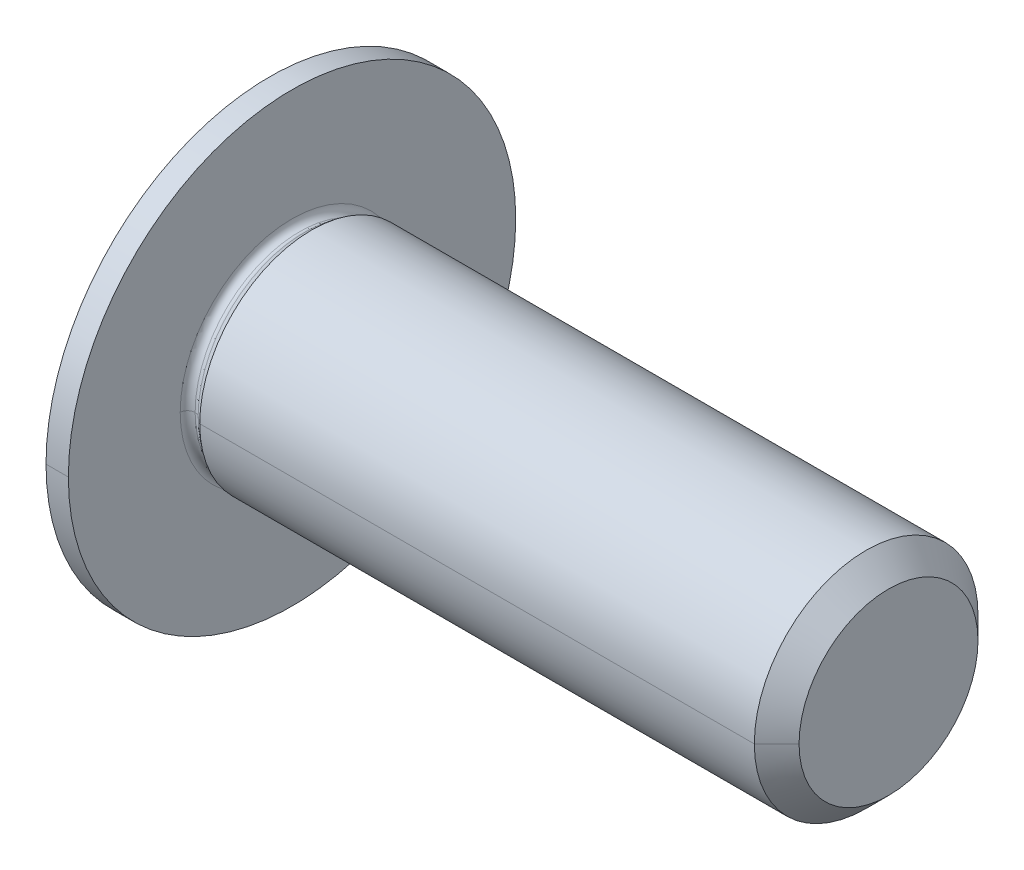
ISO-10303-21;
HEADER;
FILE_DESCRIPTION(('STEP AP214'),'2;1');
FILE_NAME('part.step','',(''),(''),'','','');
FILE_SCHEMA(('AUTOMOTIVE_DESIGN { 1 0 10303 214 1 1 1 1 }'));
ENDSEC;
DATA;
#1=APPLICATION_CONTEXT('core data for automotive mechanical design processes');
#2=APPLICATION_PROTOCOL_DEFINITION('international standard','automotive_design',2000,#1);
#3=PRODUCT_CONTEXT('',#1,'mechanical');
#4=PRODUCT('Part','Part','',(#3));
#5=PRODUCT_RELATED_PRODUCT_CATEGORY('part','',(#4));
#6=PRODUCT_DEFINITION_FORMATION('','',#4);
#7=PRODUCT_DEFINITION_CONTEXT('part definition',#1,'design');
#8=PRODUCT_DEFINITION('design','',#6,#7);
#9=PRODUCT_DEFINITION_SHAPE('','',#8);
#10=(LENGTH_UNIT() NAMED_UNIT(*) SI_UNIT(.MILLI.,.METRE.));
#11=(NAMED_UNIT(*) PLANE_ANGLE_UNIT() SI_UNIT($,.RADIAN.));
#12=(NAMED_UNIT(*) SI_UNIT($,.STERADIAN.) SOLID_ANGLE_UNIT());
#13=UNCERTAINTY_MEASURE_WITH_UNIT(LENGTH_MEASURE(1.E-05),#10,'distance_accuracy_value','');
#14=(GEOMETRIC_REPRESENTATION_CONTEXT(3) GLOBAL_UNCERTAINTY_ASSIGNED_CONTEXT((#13)) GLOBAL_UNIT_ASSIGNED_CONTEXT((#10,
#11,#12)) REPRESENTATION_CONTEXT('',''));
#15=CARTESIAN_POINT('',(0.,0.,0.));
#16=DIRECTION('',(0.,0.,1.));
#17=DIRECTION('',(1.,0.,0.));
#18=AXIS2_PLACEMENT_3D('',#15,#16,#17);
#19=CARTESIAN_POINT('',(-6.16182572614108,1.42301269667484,-0.821576763485476));
#20=DIRECTION('',(-0.966234939601246,0.22314240099168,-0.128831325280166));
#21=DIRECTION('',(-0.132163720091018,0.,0.991227900682635));
#22=AXIS2_PLACEMENT_3D('',#19,#20,#21);
#23=PLANE('',#22);
#24=DIRECTION('',(-0.225017580185204,-0.487177351846224,0.843815925694518));
#25=VECTOR('',#24,1.);
#26=CARTESIAN_POINT('',(-6.6,0.,0.));
#27=LINE('',#26,#25);
#28=CARTESIAN_POINT('',(-6.6,0.,0.));
#29=VERTEX_POINT('',#28);
#30=CARTESIAN_POINT('',(-6.8,-0.43301270189222,0.75));
#31=VERTEX_POINT('',#30);
#32=EDGE_CURVE('E176',#29,#31,#27,.T.);
#33=ORIENTED_EDGE('',*,*,#32,.F.);
#34=DIRECTION('',(-0.225017580185204,-0.974354703692446,0.));
#35=VECTOR('',#34,1.);
#36=CARTESIAN_POINT('',(-6.6,0.,0.));
#37=LINE('',#36,#35);
#38=CARTESIAN_POINT('',(-6.8,-0.866025403784439,0.));
#39=VERTEX_POINT('',#38);
#40=EDGE_CURVE('E10',#29,#39,#37,.T.);
#41=ORIENTED_EDGE('',*,*,#40,.T.);
#42=DIRECTION('',(0.,0.5,0.866025403784439));
#43=VECTOR('',#42,1.);
#44=CARTESIAN_POINT('',(-6.8,-0.433012701892218,0.75));
#45=LINE('',#44,#43);
#46=EDGE_CURVE('E231',#39,#31,#45,.T.);
#47=ORIENTED_EDGE('',*,*,#46,.T.);
#48=EDGE_LOOP('',(#33,#41,#47));
#49=FACE_BOUND('',#48,.T.);
#50=ADVANCED_FACE('F16',(#49),#23,.T.);
#51=CARTESIAN_POINT('',(-6.16182572614108,1.42301269667484,0.821576763485476));
#52=DIRECTION('',(-0.966234939601246,0.22314240099168,0.128831325280166));
#53=DIRECTION('',(0.132163720091018,0.,0.991227900682635));
#54=AXIS2_PLACEMENT_3D('',#51,#52,#53);
#55=PLANE('',#54);
#56=ORIENTED_EDGE('',*,*,#40,.F.);
#57=DIRECTION('',(-0.225017580185204,-0.487177351846223,-0.843815925694518));
#58=VECTOR('',#57,1.);
#59=CARTESIAN_POINT('',(-6.6,0.,0.));
#60=LINE('',#59,#58);
#61=CARTESIAN_POINT('',(-6.8,-0.43301270189222,-0.75));
#62=VERTEX_POINT('',#61);
#63=EDGE_CURVE('E27',#29,#62,#60,.T.);
#64=ORIENTED_EDGE('',*,*,#63,.T.);
#65=DIRECTION('',(0.,-0.5,0.866025403784438));
#66=VECTOR('',#65,1.);
#67=CARTESIAN_POINT('',(-6.8,-0.86602540378444,0.));
#68=LINE('',#67,#66);
#69=EDGE_CURVE('E20',#62,#39,#68,.T.);
#70=ORIENTED_EDGE('',*,*,#69,.T.);
#71=EDGE_LOOP('',(#56,#64,#70));
#72=FACE_BOUND('',#71,.T.);
#73=ADVANCED_FACE('F433',(#72),#55,.T.);
#74=CARTESIAN_POINT('',(-6.16182572614108,0.,1.64315352697095));
#75=DIRECTION('',(-0.966234939601246,0.,0.257662650560332));
#76=DIRECTION('',(0.,1.,0.));
#77=AXIS2_PLACEMENT_3D('',#74,#75,#76);
#78=PLANE('',#77);
#79=ORIENTED_EDGE('',*,*,#63,.F.);
#80=DIRECTION('',(-0.225017580185204,0.487177351846223,-0.843815925694518));
#81=VECTOR('',#80,1.);
#82=CARTESIAN_POINT('',(-6.6,0.,0.));
#83=LINE('',#82,#81);
#84=CARTESIAN_POINT('',(-6.8,0.43301270189222,-0.75));
#85=VERTEX_POINT('',#84);
#86=EDGE_CURVE('E277',#29,#85,#83,.T.);
#87=ORIENTED_EDGE('',*,*,#86,.T.);
#88=DIRECTION('',(0.,-1.,0.));
#89=VECTOR('',#88,1.);
#90=CARTESIAN_POINT('',(-6.8,0.,-0.75));
#91=LINE('',#90,#89);
#92=EDGE_CURVE('E241',#85,#62,#91,.T.);
#93=ORIENTED_EDGE('',*,*,#92,.T.);
#94=EDGE_LOOP('',(#79,#87,#93));
#95=FACE_BOUND('',#94,.T.);
#96=ADVANCED_FACE('F408',(#95),#78,.T.);
#97=CARTESIAN_POINT('',(-6.16182572614108,-1.42301269667484,0.821576763485475));
#98=DIRECTION('',(-0.966234939601246,-0.22314240099168,0.128831325280166));
#99=DIRECTION('',(-0.225017580185204,0.974354703692446,0.));
#100=AXIS2_PLACEMENT_3D('',#97,#98,#99);
#101=PLANE('',#100);
#102=ORIENTED_EDGE('',*,*,#86,.F.);
#103=DIRECTION('',(-0.225017580185204,0.974354703692446,0.));
#104=VECTOR('',#103,1.);
#105=CARTESIAN_POINT('',(-6.6,0.,0.));
#106=LINE('',#105,#104);
#107=CARTESIAN_POINT('',(-6.8,0.866025403784439,0.));
#108=VERTEX_POINT('',#107);
#109=EDGE_CURVE('E173',#29,#108,#106,.T.);
#110=ORIENTED_EDGE('',*,*,#109,.T.);
#111=DIRECTION('',(0.,-0.5,-0.866025403784439));
#112=VECTOR('',#111,1.);
#113=CARTESIAN_POINT('',(-6.8,0.43301270189222,-0.75));
#114=LINE('',#113,#112);
#115=EDGE_CURVE('E240',#108,#85,#114,.T.);
#116=ORIENTED_EDGE('',*,*,#115,.T.);
#117=EDGE_LOOP('',(#102,#110,#116));
#118=FACE_BOUND('',#117,.T.);
#119=ADVANCED_FACE('F18',(#118),#101,.T.);
#120=CARTESIAN_POINT('',(-6.16182572614108,0.,-1.64315352697095));
#121=DIRECTION('',(-0.966234939601246,0.,-0.257662650560332));
#122=DIRECTION('',(-0.257662650560332,0.,0.966234939601246));
#123=AXIS2_PLACEMENT_3D('',#120,#121,#122);
#124=PLANE('',#123);
#125=DIRECTION('',(-0.225017580185204,0.487177351846224,0.843815925694518));
#126=VECTOR('',#125,1.);
#127=CARTESIAN_POINT('',(-6.6,0.,0.));
#128=LINE('',#127,#126);
#129=CARTESIAN_POINT('',(-6.8,0.43301270189222,0.75));
#130=VERTEX_POINT('',#129);
#131=EDGE_CURVE('E167',#29,#130,#128,.T.);
#132=ORIENTED_EDGE('',*,*,#131,.F.);
#133=ORIENTED_EDGE('',*,*,#32,.T.);
#134=DIRECTION('',(0.,1.,0.));
#135=VECTOR('',#134,1.);
#136=CARTESIAN_POINT('',(-6.8,0.,0.75));
#137=LINE('',#136,#135);
#138=EDGE_CURVE('E179',#31,#130,#137,.T.);
#139=ORIENTED_EDGE('',*,*,#138,.T.);
#140=EDGE_LOOP('',(#132,#133,#139));
#141=FACE_BOUND('',#140,.T.);
#142=ADVANCED_FACE('F181',(#141),#124,.T.);
#143=CARTESIAN_POINT('',(-6.16182572614108,-1.42301269667484,-0.821576763485475));
#144=DIRECTION('',(-0.966234939601246,-0.22314240099168,-0.128831325280166));
#145=DIRECTION('',(-0.225017580185204,0.974354703692446,0.));
#146=AXIS2_PLACEMENT_3D('',#143,#144,#145);
#147=PLANE('',#146);
#148=ORIENTED_EDGE('',*,*,#109,.F.);
#149=ORIENTED_EDGE('',*,*,#131,.T.);
#150=DIRECTION('',(0.,0.5,-0.866025403784439));
#151=VECTOR('',#150,1.);
#152=CARTESIAN_POINT('',(-6.8,0.866025403784439,0.));
#153=LINE('',#152,#151);
#154=EDGE_CURVE('E171',#130,#108,#153,.T.);
#155=ORIENTED_EDGE('',*,*,#154,.T.);
#156=EDGE_LOOP('',(#148,#149,#155));
#157=FACE_BOUND('',#156,.T.);
#158=ADVANCED_FACE('F169',(#157),#147,.T.);
#159=CARTESIAN_POINT('',(0.,0.,0.));
#160=DIRECTION('',(-1.,0.,0.));
#161=DIRECTION('',(0.,0.,1.));
#162=AXIS2_PLACEMENT_3D('',#159,#160,#161);
#163=CONICAL_SURFACE('',#162,1.2,0.785398163397448);
#164=DIRECTION('',(-0.707106781186548,0.,-0.707106781186547));
#165=VECTOR('',#164,1.);
#166=CARTESIAN_POINT('',(0.,0.,-1.2));
#167=LINE('',#166,#165);
#168=CARTESIAN_POINT('',(0.,0.,-1.2));
#169=VERTEX_POINT('',#168);
#170=CARTESIAN_POINT('',(-0.3,0.,-1.5));
#171=VERTEX_POINT('',#170);
#172=EDGE_CURVE('E216',#169,#171,#167,.T.);
#173=ORIENTED_EDGE('',*,*,#172,.F.);
#174=CARTESIAN_POINT('',(0.,0.,0.));
#175=DIRECTION('',(1.,0.,0.));
#176=DIRECTION('',(0.,0.,-1.));
#177=AXIS2_PLACEMENT_3D('',#174,#175,#176);
#178=CIRCLE('',#177,1.2);
#179=CARTESIAN_POINT('',(0.,0.,1.2));
#180=VERTEX_POINT('',#179);
#181=EDGE_CURVE('E111',#180,#169,#178,.T.);
#182=ORIENTED_EDGE('',*,*,#181,.F.);
#183=DIRECTION('',(-0.707106781186548,0.,0.707106781186547));
#184=VECTOR('',#183,1.);
#185=CARTESIAN_POINT('',(0.,0.,1.2));
#186=LINE('',#185,#184);
#187=CARTESIAN_POINT('',(-0.3,0.,1.5));
#188=VERTEX_POINT('',#187);
#189=EDGE_CURVE('E268',#180,#188,#186,.T.);
#190=ORIENTED_EDGE('',*,*,#189,.T.);
#191=CARTESIAN_POINT('',(-0.3,0.,0.));
#192=DIRECTION('',(-1.,0.,0.));
#193=DIRECTION('',(0.,0.,-1.));
#194=AXIS2_PLACEMENT_3D('',#191,#192,#193);
#195=CIRCLE('',#194,1.5);
#196=EDGE_CURVE('E102',#171,#188,#195,.T.);
#197=ORIENTED_EDGE('',*,*,#196,.F.);
#198=EDGE_LOOP('',(#173,#182,#190,#197));
#199=FACE_BOUND('',#198,.T.);
#200=ADVANCED_FACE('F579',(#199),#163,.T.);
#201=CARTESIAN_POINT('',(-6.8,0.866025403784439,0.));
#202=DIRECTION('',(0.,0.866025403784439,-0.5));
#203=DIRECTION('',(-1.,0.,0.));
#204=AXIS2_PLACEMENT_3D('',#201,#202,#203);
#205=PLANE('',#204);
#206=DIRECTION('',(0.,-0.5,-0.866025403784439));
#207=VECTOR('',#206,1.);
#208=CARTESIAN_POINT('',(-8.8,0.866025403784439,0.));
#209=LINE('',#208,#207);
#210=CARTESIAN_POINT('',(-8.8,0.866025403784439,0.));
#211=VERTEX_POINT('',#210);
#212=CARTESIAN_POINT('',(-8.8,0.43301270189222,-0.75));
#213=VERTEX_POINT('',#212);
#214=EDGE_CURVE('E206',#211,#213,#209,.T.);
#215=ORIENTED_EDGE('',*,*,#214,.T.);
#216=DIRECTION('',(-1.,0.,0.));
#217=VECTOR('',#216,1.);
#218=CARTESIAN_POINT('',(-6.8,0.43301270189222,-0.75));
#219=LINE('',#218,#217);
#220=EDGE_CURVE('E237',#85,#213,#219,.T.);
#221=ORIENTED_EDGE('',*,*,#220,.F.);
#222=ORIENTED_EDGE('',*,*,#115,.F.);
#223=DIRECTION('',(-1.,0.,0.));
#224=VECTOR('',#223,1.);
#225=CARTESIAN_POINT('',(-6.8,0.866025403784439,0.));
#226=LINE('',#225,#224);
#227=EDGE_CURVE('E199',#108,#211,#226,.T.);
#228=ORIENTED_EDGE('',*,*,#227,.T.);
#229=EDGE_LOOP('',(#215,#221,#222,#228));
#230=FACE_BOUND('',#229,.T.);
#231=ADVANCED_FACE('F464',(#230),#205,.F.);
#232=CARTESIAN_POINT('',(-6.8,0.43301270189222,-0.75));
#233=DIRECTION('',(0.,0.,-1.));
#234=DIRECTION('',(0.,-1.,0.));
#235=AXIS2_PLACEMENT_3D('',#232,#233,#234);
#236=PLANE('',#235);
#237=DIRECTION('',(0.,-1.,0.));
#238=VECTOR('',#237,1.);
#239=CARTESIAN_POINT('',(-8.8,0.43301270189222,-0.75));
#240=LINE('',#239,#238);
#241=CARTESIAN_POINT('',(-8.8,-0.433012701892219,-0.75));
#242=VERTEX_POINT('',#241);
#243=EDGE_CURVE('E246',#213,#242,#240,.T.);
#244=ORIENTED_EDGE('',*,*,#243,.T.);
#245=DIRECTION('',(-1.,0.,0.));
#246=VECTOR('',#245,1.);
#247=CARTESIAN_POINT('',(-6.8,-0.433012701892219,-0.75));
#248=LINE('',#247,#246);
#249=EDGE_CURVE('E334',#62,#242,#248,.T.);
#250=ORIENTED_EDGE('',*,*,#249,.F.);
#251=ORIENTED_EDGE('',*,*,#92,.F.);
#252=ORIENTED_EDGE('',*,*,#220,.T.);
#253=EDGE_LOOP('',(#244,#250,#251,#252));
#254=FACE_BOUND('',#253,.T.);
#255=ADVANCED_FACE('F458',(#254),#236,.F.);
#256=CARTESIAN_POINT('',(-6.8,-0.433012701892219,-0.75));
#257=DIRECTION('',(0.,-0.866025403784439,-0.5));
#258=DIRECTION('',(0.,0.5,-0.866025403784439));
#259=AXIS2_PLACEMENT_3D('',#256,#257,#258);
#260=PLANE('',#259);
#261=DIRECTION('',(0.,-0.5,0.866025403784439));
#262=VECTOR('',#261,1.);
#263=CARTESIAN_POINT('',(-8.8,-0.433012701892219,-0.75));
#264=LINE('',#263,#262);
#265=CARTESIAN_POINT('',(-8.8,-0.866025403784439,0.));
#266=VERTEX_POINT('',#265);
#267=EDGE_CURVE('E242',#242,#266,#264,.T.);
#268=ORIENTED_EDGE('',*,*,#267,.T.);
#269=DIRECTION('',(-1.,0.,0.));
#270=VECTOR('',#269,1.);
#271=CARTESIAN_POINT('',(-6.8,-0.866025403784439,0.));
#272=LINE('',#271,#270);
#273=EDGE_CURVE('E228',#39,#266,#272,.T.);
#274=ORIENTED_EDGE('',*,*,#273,.F.);
#275=ORIENTED_EDGE('',*,*,#69,.F.);
#276=ORIENTED_EDGE('',*,*,#249,.T.);
#277=EDGE_LOOP('',(#268,#274,#275,#276));
#278=FACE_BOUND('',#277,.T.);
#279=ADVANCED_FACE('F463',(#278),#260,.F.);
#280=CARTESIAN_POINT('',(-6.8,-0.866025403784439,0.));
#281=DIRECTION('',(0.,-0.866025403784439,0.5));
#282=DIRECTION('',(-1.,0.,0.));
#283=AXIS2_PLACEMENT_3D('',#280,#281,#282);
#284=PLANE('',#283);
#285=DIRECTION('',(0.,0.5,0.866025403784439));
#286=VECTOR('',#285,1.);
#287=CARTESIAN_POINT('',(-8.8,-0.866025403784439,0.));
#288=LINE('',#287,#286);
#289=CARTESIAN_POINT('',(-8.8,-0.43301270189222,0.75));
#290=VERTEX_POINT('',#289);
#291=EDGE_CURVE('E247',#266,#290,#288,.T.);
#292=ORIENTED_EDGE('',*,*,#291,.T.);
#293=DIRECTION('',(-1.,0.,0.));
#294=VECTOR('',#293,1.);
#295=CARTESIAN_POINT('',(-6.8,-0.43301270189222,0.75));
#296=LINE('',#295,#294);
#297=EDGE_CURVE('E186',#31,#290,#296,.T.);
#298=ORIENTED_EDGE('',*,*,#297,.F.);
#299=ORIENTED_EDGE('',*,*,#46,.F.);
#300=ORIENTED_EDGE('',*,*,#273,.T.);
#301=EDGE_LOOP('',(#292,#298,#299,#300));
#302=FACE_BOUND('',#301,.T.);
#303=ADVANCED_FACE('F449',(#302),#284,.F.);
#304=CARTESIAN_POINT('',(-6.8,-0.43301270189222,0.75));
#305=DIRECTION('',(0.,0.,1.));
#306=DIRECTION('',(0.,-1.,0.));
#307=AXIS2_PLACEMENT_3D('',#304,#305,#306);
#308=PLANE('',#307);
#309=DIRECTION('',(0.,1.,0.));
#310=VECTOR('',#309,1.);
#311=CARTESIAN_POINT('',(-8.8,-0.43301270189222,0.75));
#312=LINE('',#311,#310);
#313=CARTESIAN_POINT('',(-8.8,0.43301270189222,0.75));
#314=VERTEX_POINT('',#313);
#315=EDGE_CURVE('E192',#290,#314,#312,.T.);
#316=ORIENTED_EDGE('',*,*,#315,.T.);
#317=DIRECTION('',(-1.,0.,0.));
#318=VECTOR('',#317,1.);
#319=CARTESIAN_POINT('',(-6.8,0.43301270189222,0.75));
#320=LINE('',#319,#318);
#321=EDGE_CURVE('E187',#130,#314,#320,.T.);
#322=ORIENTED_EDGE('',*,*,#321,.F.);
#323=ORIENTED_EDGE('',*,*,#138,.F.);
#324=ORIENTED_EDGE('',*,*,#297,.T.);
#325=EDGE_LOOP('',(#316,#322,#323,#324));
#326=FACE_BOUND('',#325,.T.);
#327=ADVANCED_FACE('F190',(#326),#308,.F.);
#328=CARTESIAN_POINT('',(-6.8,0.43301270189222,0.75));
#329=DIRECTION('',(0.,0.866025403784439,0.5));
#330=DIRECTION('',(1.,0.,0.));
#331=AXIS2_PLACEMENT_3D('',#328,#329,#330);
#332=PLANE('',#331);
#333=DIRECTION('',(0.,0.5,-0.866025403784439));
#334=VECTOR('',#333,1.);
#335=CARTESIAN_POINT('',(-8.8,0.43301270189222,0.75));
#336=LINE('',#335,#334);
#337=EDGE_CURVE('E218',#314,#211,#336,.T.);
#338=ORIENTED_EDGE('',*,*,#337,.T.);
#339=ORIENTED_EDGE('',*,*,#227,.F.);
#340=ORIENTED_EDGE('',*,*,#154,.F.);
#341=ORIENTED_EDGE('',*,*,#321,.T.);
#342=EDGE_LOOP('',(#338,#339,#340,#341));
#343=FACE_BOUND('',#342,.T.);
#344=ADVANCED_FACE('F198',(#343),#332,.F.);
#345=CARTESIAN_POINT('',(-8.8,1.6262612902727,0.));
#346=DIRECTION('',(-1.,0.,0.));
#347=DIRECTION('',(0.,0.,1.));
#348=AXIS2_PLACEMENT_3D('',#345,#346,#347);
#349=PLANE('',#348);
#350=ORIENTED_EDGE('',*,*,#337,.F.);
#351=ORIENTED_EDGE('',*,*,#315,.F.);
#352=ORIENTED_EDGE('',*,*,#291,.F.);
#353=ORIENTED_EDGE('',*,*,#267,.F.);
#354=ORIENTED_EDGE('',*,*,#243,.F.);
#355=ORIENTED_EDGE('',*,*,#214,.F.);
#356=EDGE_LOOP('',(#350,#351,#352,#353,#354,#355));
#357=FACE_BOUND('',#356,.T.);
#358=CARTESIAN_POINT('',(-8.8,0.,0.));
#359=DIRECTION('',(1.,0.,0.));
#360=DIRECTION('',(0.,0.,-1.));
#361=AXIS2_PLACEMENT_3D('',#358,#359,#360);
#362=CIRCLE('',#361,1.6262612902727);
#363=CARTESIAN_POINT('',(-8.8,0.,-1.6262612902727));
#364=VERTEX_POINT('',#363);
#365=CARTESIAN_POINT('',(-8.8,0.,1.6262612902727));
#366=VERTEX_POINT('',#365);
#367=EDGE_CURVE('E259',#364,#366,#362,.T.);
#368=ORIENTED_EDGE('',*,*,#367,.F.);
#369=CARTESIAN_POINT('',(-8.8,0.,0.));
#370=DIRECTION('',(1.,0.,0.));
#371=DIRECTION('',(0.,0.,-1.));
#372=AXIS2_PLACEMENT_3D('',#369,#370,#371);
#373=CIRCLE('',#372,1.6262612902727);
#374=EDGE_CURVE('E221',#366,#364,#373,.T.);
#375=ORIENTED_EDGE('',*,*,#374,.F.);
#376=EDGE_LOOP('',(#368,#375));
#377=FACE_BOUND('',#376,.T.);
#378=ADVANCED_FACE('F559',(#357,#377),#349,.T.);
#379=CARTESIAN_POINT('',(-8.3,0.,0.));
#380=DIRECTION('',(1.,0.,0.));
#381=DIRECTION('',(0.,0.,-1.));
#382=AXIS2_PLACEMENT_3D('',#379,#380,#381);
#383=CONICAL_SURFACE('',#382,3.,1.22173047639603);
#384=DIRECTION('',(0.34202014332567,0.,0.939692620785908));
#385=VECTOR('',#384,1.);
#386=CARTESIAN_POINT('',(-8.3,0.,3.));
#387=LINE('',#386,#385);
#388=CARTESIAN_POINT('',(-8.3,0.,3.));
#389=VERTEX_POINT('',#388);
#390=EDGE_CURVE('E254',#366,#389,#387,.T.);
#391=ORIENTED_EDGE('',*,*,#390,.F.);
#392=ORIENTED_EDGE('',*,*,#374,.T.);
#393=DIRECTION('',(0.34202014332567,0.,-0.939692620785908));
#394=VECTOR('',#393,1.);
#395=CARTESIAN_POINT('',(-8.3,0.,-3.));
#396=LINE('',#395,#394);
#397=CARTESIAN_POINT('',(-8.3,0.,-3.));
#398=VERTEX_POINT('',#397);
#399=EDGE_CURVE('E314',#364,#398,#396,.T.);
#400=ORIENTED_EDGE('',*,*,#399,.T.);
#401=CARTESIAN_POINT('',(-8.3,0.,0.));
#402=DIRECTION('',(1.,0.,0.));
#403=DIRECTION('',(0.,0.,-1.));
#404=AXIS2_PLACEMENT_3D('',#401,#402,#403);
#405=CIRCLE('',#404,3.);
#406=EDGE_CURVE('E290',#389,#398,#405,.T.);
#407=ORIENTED_EDGE('',*,*,#406,.F.);
#408=EDGE_LOOP('',(#391,#392,#400,#407));
#409=FACE_BOUND('',#408,.T.);
#410=ADVANCED_FACE('F517',(#409),#383,.T.);
#411=CARTESIAN_POINT('',(0.,0.,0.));
#412=DIRECTION('',(1.,0.,0.));
#413=DIRECTION('',(0.,0.,-1.));
#414=AXIS2_PLACEMENT_3D('',#411,#412,#413);
#415=CYLINDRICAL_SURFACE('',#414,3.);
#416=DIRECTION('',(1.,0.,0.));
#417=VECTOR('',#416,1.);
#418=CARTESIAN_POINT('',(0.,0.,3.));
#419=LINE('',#418,#417);
#420=CARTESIAN_POINT('',(-8.,0.,3.));
#421=VERTEX_POINT('',#420);
#422=EDGE_CURVE('E273',#389,#421,#419,.T.);
#423=ORIENTED_EDGE('',*,*,#422,.F.);
#424=ORIENTED_EDGE('',*,*,#406,.T.);
#425=DIRECTION('',(1.,0.,0.));
#426=VECTOR('',#425,1.);
#427=CARTESIAN_POINT('',(0.,0.,-3.));
#428=LINE('',#427,#426);
#429=CARTESIAN_POINT('',(-8.,0.,-3.));
#430=VERTEX_POINT('',#429);
#431=EDGE_CURVE('E272',#398,#430,#428,.T.);
#432=ORIENTED_EDGE('',*,*,#431,.T.);
#433=CARTESIAN_POINT('',(-8.,0.,0.));
#434=DIRECTION('',(1.,0.,0.));
#435=DIRECTION('',(0.,0.,-1.));
#436=AXIS2_PLACEMENT_3D('',#433,#434,#435);
#437=CIRCLE('',#436,3.);
#438=EDGE_CURVE('E288',#421,#430,#437,.T.);
#439=ORIENTED_EDGE('',*,*,#438,.F.);
#440=EDGE_LOOP('',(#423,#424,#432,#439));
#441=FACE_BOUND('',#440,.T.);
#442=ADVANCED_FACE('F511',(#441),#415,.T.);
#443=CARTESIAN_POINT('',(-8.,1.5,0.));
#444=DIRECTION('',(1.,0.,0.));
#445=DIRECTION('',(0.,1.,0.));
#446=AXIS2_PLACEMENT_3D('',#443,#444,#445);
#447=PLANE('',#446);
#448=CARTESIAN_POINT('',(-8.,0.,0.));
#449=DIRECTION('',(1.,0.,0.));
#450=DIRECTION('',(0.,0.,-1.));
#451=AXIS2_PLACEMENT_3D('',#448,#449,#450);
#452=CIRCLE('',#451,1.5);
#453=CARTESIAN_POINT('',(-8.,0.,-1.5));
#454=VERTEX_POINT('',#453);
#455=CARTESIAN_POINT('',(-8.,0.,1.5));
#456=VERTEX_POINT('',#455);
#457=EDGE_CURVE('E210',#454,#456,#452,.T.);
#458=ORIENTED_EDGE('',*,*,#457,.F.);
#459=CARTESIAN_POINT('',(-8.,0.,0.));
#460=DIRECTION('',(1.,0.,0.));
#461=DIRECTION('',(0.,0.,-1.));
#462=AXIS2_PLACEMENT_3D('',#459,#460,#461);
#463=CIRCLE('',#462,1.5);
#464=EDGE_CURVE('E360',#456,#454,#463,.T.);
#465=ORIENTED_EDGE('',*,*,#464,.F.);
#466=EDGE_LOOP('',(#458,#465));
#467=FACE_BOUND('',#466,.T.);
#468=CARTESIAN_POINT('',(-8.,0.,0.));
#469=DIRECTION('',(1.,0.,0.));
#470=DIRECTION('',(0.,0.,-1.));
#471=AXIS2_PLACEMENT_3D('',#468,#469,#470);
#472=CIRCLE('',#471,3.);
#473=EDGE_CURVE('E269',#430,#421,#472,.T.);
#474=ORIENTED_EDGE('',*,*,#473,.T.);
#475=ORIENTED_EDGE('',*,*,#438,.T.);
#476=EDGE_LOOP('',(#474,#475));
#477=FACE_BOUND('',#476,.T.);
#478=ADVANCED_FACE('F516',(#467,#477),#447,.T.);
#479=CARTESIAN_POINT('',(-7.9,0.,0.));
#480=DIRECTION('',(1.,0.,0.));
#481=DIRECTION('',(0.,0.,-1.));
#482=AXIS2_PLACEMENT_3D('',#479,#480,#481);
#483=TOROIDAL_SURFACE('',#482,1.5,0.1);
#484=CARTESIAN_POINT('',(-7.9,0.,0.));
#485=DIRECTION('',(1.,0.,0.));
#486=DIRECTION('',(0.,0.,-1.));
#487=AXIS2_PLACEMENT_3D('',#484,#485,#486);
#488=CIRCLE('',#487,1.4);
#489=CARTESIAN_POINT('',(-7.9,0.,-1.4));
#490=VERTEX_POINT('',#489);
#491=CARTESIAN_POINT('',(-7.9,0.,1.4));
#492=VERTEX_POINT('',#491);
#493=EDGE_CURVE('E264',#490,#492,#488,.T.);
#494=ORIENTED_EDGE('',*,*,#493,.F.);
#495=CARTESIAN_POINT('',(-7.9,0.,-1.5));
#496=DIRECTION('',(0.,-1.,0.));
#497=DIRECTION('',(0.,0.,-1.));
#498=AXIS2_PLACEMENT_3D('',#495,#496,#497);
#499=CIRCLE('',#498,0.1);
#500=EDGE_CURVE('E356',#490,#454,#499,.T.);
#501=ORIENTED_EDGE('',*,*,#500,.T.);
#502=ORIENTED_EDGE('',*,*,#457,.T.);
#503=CARTESIAN_POINT('',(-7.9,0.,1.5));
#504=DIRECTION('',(0.,1.,0.));
#505=DIRECTION('',(0.,0.,1.));
#506=AXIS2_PLACEMENT_3D('',#503,#504,#505);
#507=CIRCLE('',#506,0.1);
#508=EDGE_CURVE('E320',#492,#456,#507,.T.);
#509=ORIENTED_EDGE('',*,*,#508,.F.);
#510=EDGE_LOOP('',(#494,#501,#502,#509));
#511=FACE_BOUND('',#510,.T.);
#512=ADVANCED_FACE('F391',(#511),#483,.F.);
#513=CARTESIAN_POINT('',(-7.73819660112501,0.,0.));
#514=DIRECTION('',(1.,0.,0.));
#515=DIRECTION('',(0.,0.,-1.));
#516=AXIS2_PLACEMENT_3D('',#513,#514,#515);
#517=CONICAL_SURFACE('',#516,1.5,0.666239432492518);
#518=DIRECTION('',(0.786151377757421,0.,0.618033988749898));
#519=VECTOR('',#518,1.);
#520=CARTESIAN_POINT('',(-7.73819660112501,0.,1.5));
#521=LINE('',#520,#519);
#522=CARTESIAN_POINT('',(-7.83819660112501,0.,1.42138486222426));
#523=VERTEX_POINT('',#522);
#524=CARTESIAN_POINT('',(-7.73819660112501,0.,1.5));
#525=VERTEX_POINT('',#524);
#526=EDGE_CURVE('E227',#523,#525,#521,.T.);
#527=ORIENTED_EDGE('',*,*,#526,.F.);
#528=CARTESIAN_POINT('',(-7.83819660112501,0.,0.));
#529=DIRECTION('',(1.,0.,0.));
#530=DIRECTION('',(0.,0.,-1.));
#531=AXIS2_PLACEMENT_3D('',#528,#529,#530);
#532=CIRCLE('',#531,1.42138486222426);
#533=CARTESIAN_POINT('',(-7.83819660112501,0.,-1.42138486222426));
#534=VERTEX_POINT('',#533);
#535=EDGE_CURVE('E217',#523,#534,#532,.T.);
#536=ORIENTED_EDGE('',*,*,#535,.T.);
#537=DIRECTION('',(0.786151377757421,0.,-0.618033988749898));
#538=VECTOR('',#537,1.);
#539=CARTESIAN_POINT('',(-7.73819660112501,0.,-1.5));
#540=LINE('',#539,#538);
#541=CARTESIAN_POINT('',(-7.73819660112501,0.,-1.5));
#542=VERTEX_POINT('',#541);
#543=EDGE_CURVE('E226',#534,#542,#540,.T.);
#544=ORIENTED_EDGE('',*,*,#543,.T.);
#545=CARTESIAN_POINT('',(-7.73819660112501,0.,0.));
#546=DIRECTION('',(1.,0.,0.));
#547=DIRECTION('',(0.,0.,-1.));
#548=AXIS2_PLACEMENT_3D('',#545,#546,#547);
#549=CIRCLE('',#548,1.5);
#550=EDGE_CURVE('E234',#525,#542,#549,.T.);
#551=ORIENTED_EDGE('',*,*,#550,.F.);
#552=EDGE_LOOP('',(#527,#536,#544,#551));
#553=FACE_BOUND('',#552,.T.);
#554=ADVANCED_FACE('F595',(#553),#517,.T.);
#555=CARTESIAN_POINT('',(0.,0.,0.));
#556=DIRECTION('',(1.,0.,0.));
#557=DIRECTION('',(0.,0.,-1.));
#558=AXIS2_PLACEMENT_3D('',#555,#556,#557);
#559=CYLINDRICAL_SURFACE('',#558,1.5);
#560=DIRECTION('',(1.,0.,0.));
#561=VECTOR('',#560,1.);
#562=CARTESIAN_POINT('',(0.,0.,1.5));
#563=LINE('',#562,#561);
#564=EDGE_CURVE('E251',#525,#188,#563,.T.);
#565=ORIENTED_EDGE('',*,*,#564,.F.);
#566=ORIENTED_EDGE('',*,*,#550,.T.);
#567=DIRECTION('',(1.,0.,0.));
#568=VECTOR('',#567,1.);
#569=CARTESIAN_POINT('',(0.,0.,-1.5));
#570=LINE('',#569,#568);
#571=EDGE_CURVE('E248',#542,#171,#570,.T.);
#572=ORIENTED_EDGE('',*,*,#571,.T.);
#573=ORIENTED_EDGE('',*,*,#196,.T.);
#574=EDGE_LOOP('',(#565,#566,#572,#573));
#575=FACE_BOUND('',#574,.T.);
#576=ADVANCED_FACE('F626',(#575),#559,.T.);
#577=CARTESIAN_POINT('',(0.,0.,0.));
#578=DIRECTION('',(1.,0.,0.));
#579=DIRECTION('',(0.,1.,0.));
#580=AXIS2_PLACEMENT_3D('',#577,#578,#579);
#581=PLANE('',#580);
#582=ORIENTED_EDGE('',*,*,#181,.T.);
#583=CARTESIAN_POINT('',(0.,0.,0.));
#584=DIRECTION('',(1.,0.,0.));
#585=DIRECTION('',(0.,0.,-1.));
#586=AXIS2_PLACEMENT_3D('',#583,#584,#585);
#587=CIRCLE('',#586,1.2);
#588=EDGE_CURVE('E212',#169,#180,#587,.T.);
#589=ORIENTED_EDGE('',*,*,#588,.T.);
#590=EDGE_LOOP('',(#582,#589));
#591=FACE_BOUND('',#590,.T.);
#592=ADVANCED_FACE('F635',(#591),#581,.T.);
#593=CARTESIAN_POINT('',(0.,0.,0.));
#594=DIRECTION('',(1.,0.,0.));
#595=DIRECTION('',(0.,0.,-1.));
#596=AXIS2_PLACEMENT_3D('',#593,#594,#595);
#597=CYLINDRICAL_SURFACE('',#596,1.5);
#598=CARTESIAN_POINT('',(-7.73819660112501,0.,0.));
#599=DIRECTION('',(1.,0.,0.));
#600=DIRECTION('',(0.,0.,-1.));
#601=AXIS2_PLACEMENT_3D('',#598,#599,#600);
#602=CIRCLE('',#601,1.5);
#603=EDGE_CURVE('E222',#542,#525,#602,.T.);
#604=ORIENTED_EDGE('',*,*,#603,.T.);
#605=ORIENTED_EDGE('',*,*,#564,.T.);
#606=CARTESIAN_POINT('',(-0.3,0.,0.));
#607=DIRECTION('',(-1.,0.,0.));
#608=DIRECTION('',(0.,0.,-1.));
#609=AXIS2_PLACEMENT_3D('',#606,#607,#608);
#610=CIRCLE('',#609,1.5);
#611=EDGE_CURVE('E287',#188,#171,#610,.T.);
#612=ORIENTED_EDGE('',*,*,#611,.T.);
#613=ORIENTED_EDGE('',*,*,#571,.F.);
#614=EDGE_LOOP('',(#604,#605,#612,#613));
#615=FACE_BOUND('',#614,.T.);
#616=ADVANCED_FACE('F502',(#615),#597,.T.);
#617=CARTESIAN_POINT('',(-7.73819660112501,0.,0.));
#618=DIRECTION('',(1.,0.,0.));
#619=DIRECTION('',(0.,0.,-1.));
#620=AXIS2_PLACEMENT_3D('',#617,#618,#619);
#621=CONICAL_SURFACE('',#620,1.5,0.666239432492518);
#622=CARTESIAN_POINT('',(-7.83819660112501,0.,0.));
#623=DIRECTION('',(1.,0.,0.));
#624=DIRECTION('',(0.,0.,-1.));
#625=AXIS2_PLACEMENT_3D('',#622,#623,#624);
#626=CIRCLE('',#625,1.42138486222426);
#627=EDGE_CURVE('E278',#534,#523,#626,.T.);
#628=ORIENTED_EDGE('',*,*,#627,.T.);
#629=ORIENTED_EDGE('',*,*,#526,.T.);
#630=ORIENTED_EDGE('',*,*,#603,.F.);
#631=ORIENTED_EDGE('',*,*,#543,.F.);
#632=EDGE_LOOP('',(#628,#629,#630,#631));
#633=FACE_BOUND('',#632,.T.);
#634=ADVANCED_FACE('F497',(#633),#621,.T.);
#635=CARTESIAN_POINT('',(-7.9,0.,0.));
#636=DIRECTION('',(1.,0.,0.));
#637=DIRECTION('',(0.,0.,-1.));
#638=AXIS2_PLACEMENT_3D('',#635,#636,#637);
#639=TOROIDAL_SURFACE('',#638,1.5,0.1);
#640=CARTESIAN_POINT('',(-7.9,0.,0.));
#641=DIRECTION('',(1.,0.,0.));
#642=DIRECTION('',(0.,0.,-1.));
#643=AXIS2_PLACEMENT_3D('',#640,#641,#642);
#644=CIRCLE('',#643,1.4);
#645=EDGE_CURVE('E282',#492,#490,#644,.T.);
#646=ORIENTED_EDGE('',*,*,#645,.F.);
#647=ORIENTED_EDGE('',*,*,#508,.T.);
#648=ORIENTED_EDGE('',*,*,#464,.T.);
#649=ORIENTED_EDGE('',*,*,#500,.F.);
#650=EDGE_LOOP('',(#646,#647,#648,#649));
#651=FACE_BOUND('',#650,.T.);
#652=ADVANCED_FACE('F386',(#651),#639,.F.);
#653=CARTESIAN_POINT('',(0.,0.,0.));
#654=DIRECTION('',(1.,0.,0.));
#655=DIRECTION('',(0.,0.,-1.));
#656=AXIS2_PLACEMENT_3D('',#653,#654,#655);
#657=CYLINDRICAL_SURFACE('',#656,3.);
#658=CARTESIAN_POINT('',(-8.3,0.,0.));
#659=DIRECTION('',(1.,0.,0.));
#660=DIRECTION('',(0.,0.,-1.));
#661=AXIS2_PLACEMENT_3D('',#658,#659,#660);
#662=CIRCLE('',#661,3.);
#663=EDGE_CURVE('E258',#398,#389,#662,.T.);
#664=ORIENTED_EDGE('',*,*,#663,.T.);
#665=ORIENTED_EDGE('',*,*,#422,.T.);
#666=ORIENTED_EDGE('',*,*,#473,.F.);
#667=ORIENTED_EDGE('',*,*,#431,.F.);
#668=EDGE_LOOP('',(#664,#665,#666,#667));
#669=FACE_BOUND('',#668,.T.);
#670=ADVANCED_FACE('F474',(#669),#657,.T.);
#671=CARTESIAN_POINT('',(-8.3,0.,0.));
#672=DIRECTION('',(1.,0.,0.));
#673=DIRECTION('',(0.,0.,-1.));
#674=AXIS2_PLACEMENT_3D('',#671,#672,#673);
#675=CONICAL_SURFACE('',#674,3.,1.22173047639603);
#676=ORIENTED_EDGE('',*,*,#367,.T.);
#677=ORIENTED_EDGE('',*,*,#390,.T.);
#678=ORIENTED_EDGE('',*,*,#663,.F.);
#679=ORIENTED_EDGE('',*,*,#399,.F.);
#680=EDGE_LOOP('',(#676,#677,#678,#679));
#681=FACE_BOUND('',#680,.T.);
#682=ADVANCED_FACE('F424',(#681),#675,.T.);
#683=CARTESIAN_POINT('',(0.,0.,0.));
#684=DIRECTION('',(-1.,0.,0.));
#685=DIRECTION('',(0.,0.,1.));
#686=AXIS2_PLACEMENT_3D('',#683,#684,#685);
#687=CONICAL_SURFACE('',#686,1.2,0.785398163397448);
#688=ORIENTED_EDGE('',*,*,#588,.F.);
#689=ORIENTED_EDGE('',*,*,#172,.T.);
#690=ORIENTED_EDGE('',*,*,#611,.F.);
#691=ORIENTED_EDGE('',*,*,#189,.F.);
#692=EDGE_LOOP('',(#688,#689,#690,#691));
#693=FACE_BOUND('',#692,.T.);
#694=ADVANCED_FACE('F418',(#693),#687,.T.);
#695=CARTESIAN_POINT('',(-7.9,0.,0.));
#696=DIRECTION('',(1.,0.,0.));
#697=DIRECTION('',(0.,0.,-1.));
#698=AXIS2_PLACEMENT_3D('',#695,#696,#697);
#699=TOROIDAL_SURFACE('',#698,1.5,0.1);
#700=CARTESIAN_POINT('',(-7.9,0.,1.5));
#701=DIRECTION('',(0.,1.,0.));
#702=DIRECTION('',(0.,0.,1.));
#703=AXIS2_PLACEMENT_3D('',#700,#701,#702);
#704=CIRCLE('',#703,0.1);
#705=EDGE_CURVE('E283',#523,#492,#704,.T.);
#706=ORIENTED_EDGE('',*,*,#705,.T.);
#707=ORIENTED_EDGE('',*,*,#645,.T.);
#708=CARTESIAN_POINT('',(-7.9,0.,-1.5));
#709=DIRECTION('',(0.,-1.,0.));
#710=DIRECTION('',(0.,0.,-1.));
#711=AXIS2_PLACEMENT_3D('',#708,#709,#710);
#712=CIRCLE('',#711,0.1);
#713=EDGE_CURVE('E260',#534,#490,#712,.T.);
#714=ORIENTED_EDGE('',*,*,#713,.F.);
#715=ORIENTED_EDGE('',*,*,#535,.F.);
#716=EDGE_LOOP('',(#706,#707,#714,#715));
#717=FACE_BOUND('',#716,.T.);
#718=ADVANCED_FACE('F423',(#717),#699,.F.);
#719=CARTESIAN_POINT('',(-7.9,0.,0.));
#720=DIRECTION('',(1.,0.,0.));
#721=DIRECTION('',(0.,0.,-1.));
#722=AXIS2_PLACEMENT_3D('',#719,#720,#721);
#723=TOROIDAL_SURFACE('',#722,1.5,0.1);
#724=ORIENTED_EDGE('',*,*,#713,.T.);
#725=ORIENTED_EDGE('',*,*,#493,.T.);
#726=ORIENTED_EDGE('',*,*,#705,.F.);
#727=ORIENTED_EDGE('',*,*,#627,.F.);
#728=EDGE_LOOP('',(#724,#725,#726,#727));
#729=FACE_BOUND('',#728,.T.);
#730=ADVANCED_FACE('F570',(#729),#723,.F.);
#731=CLOSED_SHELL('',(#50,#73,#96,#119,#142,#158,#200,#231,#255,#279,#303,#327,#344,#378,#410,
#442,#478,#512,#554,#576,#592,#616,#634,#652,#670,#682,#694,#718,#730));
#732=MANIFOLD_SOLID_BREP('B1',#731);
#733=ADVANCED_BREP_SHAPE_REPRESENTATION('',(#18,#732),#14);
#734=SHAPE_DEFINITION_REPRESENTATION(#9,#733);
ENDSEC;
END-ISO-10303-21;
